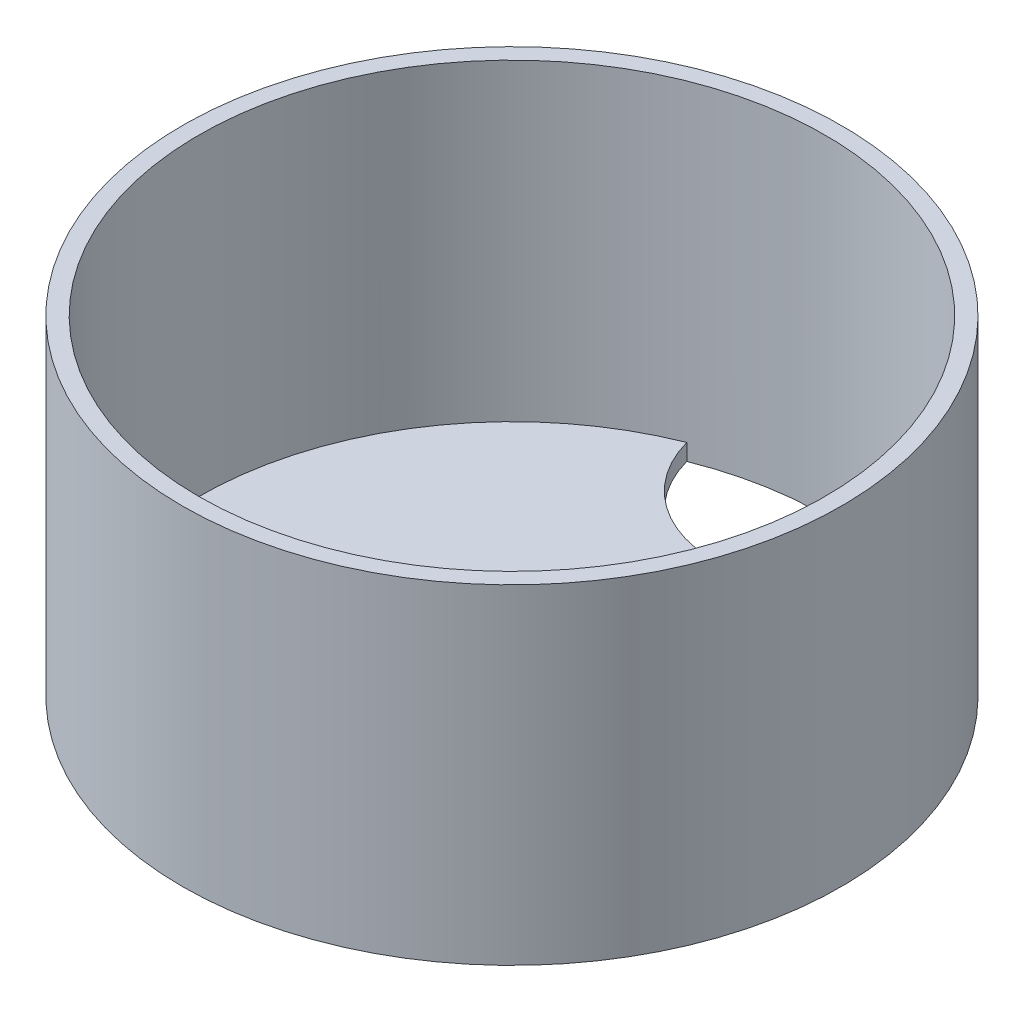
ISO-10303-21;
HEADER;
FILE_DESCRIPTION(('STEP AP214'),'2;1');
FILE_NAME('part.step','',(''),(''),'','','');
FILE_SCHEMA(('AUTOMOTIVE_DESIGN { 1 0 10303 214 1 1 1 1 }'));
ENDSEC;
DATA;
#1=APPLICATION_CONTEXT('core data for automotive mechanical design processes');
#2=APPLICATION_PROTOCOL_DEFINITION('international standard','automotive_design',2000,#1);
#3=PRODUCT_CONTEXT('',#1,'mechanical');
#4=PRODUCT('Part','Part','',(#3));
#5=PRODUCT_RELATED_PRODUCT_CATEGORY('part','',(#4));
#6=PRODUCT_DEFINITION_FORMATION('','',#4);
#7=PRODUCT_DEFINITION_CONTEXT('part definition',#1,'design');
#8=PRODUCT_DEFINITION('design','',#6,#7);
#9=PRODUCT_DEFINITION_SHAPE('','',#8);
#10=(LENGTH_UNIT() NAMED_UNIT(*) SI_UNIT(.MILLI.,.METRE.));
#11=(NAMED_UNIT(*) PLANE_ANGLE_UNIT() SI_UNIT($,.RADIAN.));
#12=(NAMED_UNIT(*) SI_UNIT($,.STERADIAN.) SOLID_ANGLE_UNIT());
#13=UNCERTAINTY_MEASURE_WITH_UNIT(LENGTH_MEASURE(1.E-05),#10,'distance_accuracy_value','');
#14=(GEOMETRIC_REPRESENTATION_CONTEXT(3) GLOBAL_UNCERTAINTY_ASSIGNED_CONTEXT((#13)) GLOBAL_UNIT_ASSIGNED_CONTEXT((#10,
#11,#12)) REPRESENTATION_CONTEXT('',''));
#15=CARTESIAN_POINT('',(0.,0.,0.));
#16=DIRECTION('',(0.,0.,1.));
#17=DIRECTION('',(1.,0.,0.));
#18=AXIS2_PLACEMENT_3D('',#15,#16,#17);
#19=CARTESIAN_POINT('',(0.,40.,0.));
#20=DIRECTION('',(0.,-1.,0.));
#21=DIRECTION('',(0.,0.,-1.));
#22=AXIS2_PLACEMENT_3D('',#19,#20,#21);
#23=CYLINDRICAL_SURFACE('',#22,40.);
#24=CARTESIAN_POINT('',(0.,40.,0.));
#25=DIRECTION('',(0.,1.,0.));
#26=DIRECTION('',(0.,0.,1.));
#27=AXIS2_PLACEMENT_3D('',#24,#25,#26);
#28=CIRCLE('',#27,40.);
#29=CARTESIAN_POINT('',(0.,40.,40.));
#30=VERTEX_POINT('',#29);
#31=EDGE_CURVE('E83',#30,#30,#28,.T.);
#32=ORIENTED_EDGE('',*,*,#31,.F.);
#33=EDGE_LOOP('',(#32));
#34=FACE_BOUND('',#33,.T.);
#35=CARTESIAN_POINT('',(0.,0.,0.));
#36=DIRECTION('',(0.,1.,0.));
#37=DIRECTION('',(0.,0.,1.));
#38=AXIS2_PLACEMENT_3D('',#35,#36,#37);
#39=CIRCLE('',#38,40.);
#40=CARTESIAN_POINT('',(0.,0.,40.));
#41=VERTEX_POINT('',#40);
#42=EDGE_CURVE('E80',#41,#41,#39,.T.);
#43=ORIENTED_EDGE('',*,*,#42,.T.);
#44=EDGE_LOOP('',(#43));
#45=FACE_BOUND('',#44,.T.);
#46=ADVANCED_FACE('F41',(#34,#45),#23,.T.);
#47=CARTESIAN_POINT('',(0.,40.,0.));
#48=DIRECTION('',(0.,1.,0.));
#49=DIRECTION('',(0.,0.,1.));
#50=AXIS2_PLACEMENT_3D('',#47,#48,#49);
#51=PLANE('',#50);
#52=CARTESIAN_POINT('',(0.,40.,0.));
#53=DIRECTION('',(0.,1.,0.));
#54=DIRECTION('',(0.,0.,1.));
#55=AXIS2_PLACEMENT_3D('',#52,#53,#54);
#56=CIRCLE('',#55,38.);
#57=CARTESIAN_POINT('',(0.,40.,38.));
#58=VERTEX_POINT('',#57);
#59=EDGE_CURVE('E72',#58,#58,#56,.T.);
#60=ORIENTED_EDGE('',*,*,#59,.F.);
#61=EDGE_LOOP('',(#60));
#62=FACE_BOUND('',#61,.T.);
#63=ORIENTED_EDGE('',*,*,#31,.T.);
#64=EDGE_LOOP('',(#63));
#65=FACE_BOUND('',#64,.T.);
#66=ADVANCED_FACE('F94',(#62,#65),#51,.T.);
#67=CARTESIAN_POINT('',(0.,0.,0.));
#68=DIRECTION('',(0.,1.,0.));
#69=DIRECTION('',(0.,0.,1.));
#70=AXIS2_PLACEMENT_3D('',#67,#68,#69);
#71=PLANE('',#70);
#72=CARTESIAN_POINT('',(0.,0.,0.));
#73=DIRECTION('',(0.,1.,0.));
#74=DIRECTION('',(0.,0.,1.));
#75=AXIS2_PLACEMENT_3D('',#72,#73,#74);
#76=CIRCLE('',#75,5.);
#77=CARTESIAN_POINT('',(0.,0.,5.));
#78=VERTEX_POINT('',#77);
#79=EDGE_CURVE('E77',#78,#78,#76,.T.);
#80=ORIENTED_EDGE('',*,*,#79,.T.);
#81=EDGE_LOOP('',(#80));
#82=FACE_BOUND('',#81,.T.);
#83=CARTESIAN_POINT('',(0.,0.,-39.1212194390183));
#84=DIRECTION('',(0.,1.,0.));
#85=DIRECTION('',(0.,0.,1.));
#86=AXIS2_PLACEMENT_3D('',#83,#84,#85);
#87=CIRCLE('',#86,14.5863569862894);
#88=CARTESIAN_POINT('',(-14.0760667026475,0.,-35.296803625578));
#89=VERTEX_POINT('',#88);
#90=CARTESIAN_POINT('',(14.0760667026475,0.,-35.296803625578));
#91=VERTEX_POINT('',#90);
#92=EDGE_CURVE('E48',#89,#91,#87,.T.);
#93=ORIENTED_EDGE('',*,*,#92,.T.);
#94=CARTESIAN_POINT('',(0.,0.,4.02455846426619E-13));
#95=DIRECTION('',(0.,1.,0.));
#96=DIRECTION('',(0.,0.,1.));
#97=AXIS2_PLACEMENT_3D('',#94,#95,#96);
#98=CIRCLE('',#97,38.0000000000004);
#99=EDGE_CURVE('E11',#91,#89,#98,.T.);
#100=ORIENTED_EDGE('',*,*,#99,.T.);
#101=EDGE_LOOP('',(#93,#100));
#102=FACE_BOUND('',#101,.T.);
#103=ORIENTED_EDGE('',*,*,#42,.F.);
#104=EDGE_LOOP('',(#103));
#105=FACE_BOUND('',#104,.T.);
#106=ADVANCED_FACE('F91',(#82,#102,#105),#71,.F.);
#107=CARTESIAN_POINT('',(0.,2.,0.));
#108=DIRECTION('',(0.,1.,0.));
#109=DIRECTION('',(0.,0.,1.));
#110=AXIS2_PLACEMENT_3D('',#107,#108,#109);
#111=CYLINDRICAL_SURFACE('',#110,38.);
#112=CARTESIAN_POINT('',(0.,2.,0.));
#113=DIRECTION('',(0.,1.,0.));
#114=DIRECTION('',(0.,0.,1.));
#115=AXIS2_PLACEMENT_3D('',#112,#113,#114);
#116=CIRCLE('',#115,38.);
#117=CARTESIAN_POINT('',(-14.0760667026475,2.,-35.296803625578));
#118=VERTEX_POINT('',#117);
#119=CARTESIAN_POINT('',(14.0760667026475,2.,-35.296803625578));
#120=VERTEX_POINT('',#119);
#121=EDGE_CURVE('E70',#118,#120,#116,.T.);
#122=ORIENTED_EDGE('',*,*,#121,.F.);
#123=DIRECTION('',(0.,1.,0.));
#124=VECTOR('',#123,1.);
#125=CARTESIAN_POINT('',(-14.0760667026475,-36.,-35.296803625578));
#126=LINE('',#125,#124);
#127=EDGE_CURVE('E55',#89,#118,#126,.T.);
#128=ORIENTED_EDGE('',*,*,#127,.F.);
#129=ORIENTED_EDGE('',*,*,#99,.F.);
#130=DIRECTION('',(0.,1.,0.));
#131=VECTOR('',#130,1.);
#132=CARTESIAN_POINT('',(14.0760667026475,-36.,-35.296803625578));
#133=LINE('',#132,#131);
#134=EDGE_CURVE('E60',#91,#120,#133,.T.);
#135=ORIENTED_EDGE('',*,*,#134,.T.);
#136=EDGE_LOOP('',(#122,#128,#129,#135));
#137=FACE_BOUND('',#136,.T.);
#138=ORIENTED_EDGE('',*,*,#59,.T.);
#139=EDGE_LOOP('',(#138));
#140=FACE_BOUND('',#139,.T.);
#141=ADVANCED_FACE('F67',(#137,#140),#111,.F.);
#142=CARTESIAN_POINT('',(0.,2.,0.));
#143=DIRECTION('',(0.,1.,0.));
#144=DIRECTION('',(0.,0.,1.));
#145=AXIS2_PLACEMENT_3D('',#142,#143,#144);
#146=PLANE('',#145);
#147=CARTESIAN_POINT('',(0.,2.,0.));
#148=DIRECTION('',(0.,1.,0.));
#149=DIRECTION('',(0.,0.,1.));
#150=AXIS2_PLACEMENT_3D('',#147,#148,#149);
#151=CIRCLE('',#150,5.);
#152=CARTESIAN_POINT('',(0.,2.,5.));
#153=VERTEX_POINT('',#152);
#154=EDGE_CURVE('E126',#153,#153,#151,.T.);
#155=ORIENTED_EDGE('',*,*,#154,.F.);
#156=EDGE_LOOP('',(#155));
#157=FACE_BOUND('',#156,.T.);
#158=CARTESIAN_POINT('',(0.,2.,-39.1212194390183));
#159=DIRECTION('',(0.,1.,0.));
#160=DIRECTION('',(0.,0.,1.));
#161=AXIS2_PLACEMENT_3D('',#158,#159,#160);
#162=CIRCLE('',#161,14.5863569862894);
#163=EDGE_CURVE('E74',#118,#120,#162,.T.);
#164=ORIENTED_EDGE('',*,*,#163,.F.);
#165=ORIENTED_EDGE('',*,*,#121,.T.);
#166=EDGE_LOOP('',(#164,#165));
#167=FACE_BOUND('',#166,.T.);
#168=ADVANCED_FACE('F79',(#157,#167),#146,.T.);
#169=CARTESIAN_POINT('',(0.,-36.,-39.1212194390183));
#170=DIRECTION('',(0.,1.,0.));
#171=DIRECTION('',(0.,0.,1.));
#172=AXIS2_PLACEMENT_3D('',#169,#170,#171);
#173=CYLINDRICAL_SURFACE('',#172,14.5863569862894);
#174=ORIENTED_EDGE('',*,*,#127,.T.);
#175=ORIENTED_EDGE('',*,*,#163,.T.);
#176=ORIENTED_EDGE('',*,*,#134,.F.);
#177=ORIENTED_EDGE('',*,*,#92,.F.);
#178=EDGE_LOOP('',(#174,#175,#176,#177));
#179=FACE_BOUND('',#178,.T.);
#180=ADVANCED_FACE('F75',(#179),#173,.F.);
#181=CARTESIAN_POINT('',(0.,-36.,0.));
#182=DIRECTION('',(0.,1.,0.));
#183=DIRECTION('',(0.,0.,1.));
#184=AXIS2_PLACEMENT_3D('',#181,#182,#183);
#185=CYLINDRICAL_SURFACE('',#184,5.);
#186=ORIENTED_EDGE('',*,*,#154,.T.);
#187=EDGE_LOOP('',(#186));
#188=FACE_BOUND('',#187,.T.);
#189=ORIENTED_EDGE('',*,*,#79,.F.);
#190=EDGE_LOOP('',(#189));
#191=FACE_BOUND('',#190,.T.);
#192=ADVANCED_FACE('F118',(#188,#191),#185,.F.);
#193=CLOSED_SHELL('',(#46,#66,#106,#141,#168,#180,#192));
#194=MANIFOLD_SOLID_BREP('B2',#193);
#195=ADVANCED_BREP_SHAPE_REPRESENTATION('',(#18,#194),#14);
#196=SHAPE_DEFINITION_REPRESENTATION(#9,#195);
ENDSEC;
END-ISO-10303-21;
